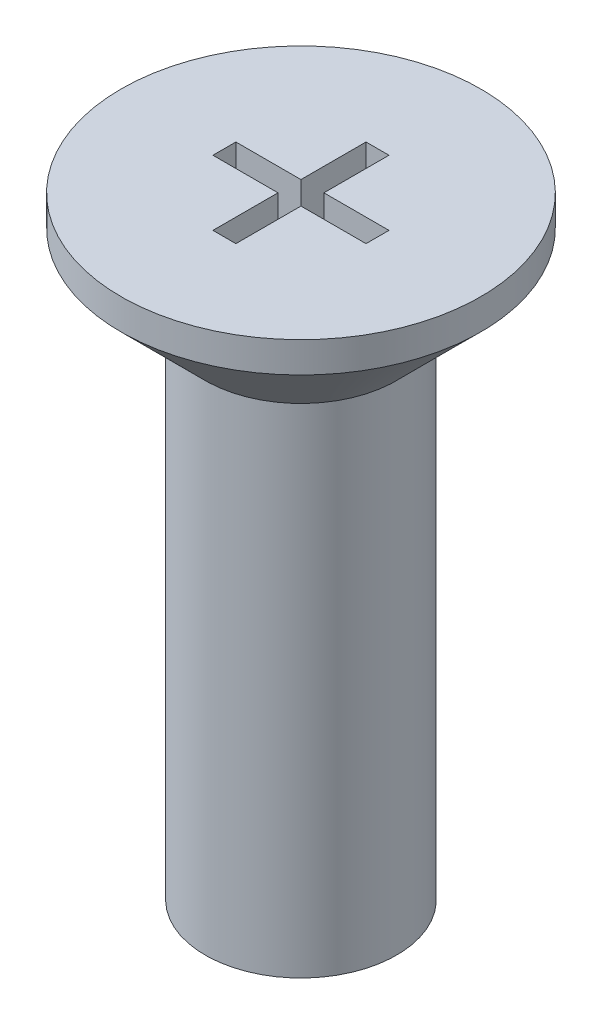
ISO-10303-21;
HEADER;
FILE_DESCRIPTION(('STEP AP214'),'2;1');
FILE_NAME('part.step','',(''),(''),'','','');
FILE_SCHEMA(('AUTOMOTIVE_DESIGN { 1 0 10303 214 1 1 1 1 }'));
ENDSEC;
DATA;
#1=APPLICATION_CONTEXT('core data for automotive mechanical design processes');
#2=APPLICATION_PROTOCOL_DEFINITION('international standard','automotive_design',2000,#1);
#3=PRODUCT_CONTEXT('',#1,'mechanical');
#4=PRODUCT('Part','Part','',(#3));
#5=PRODUCT_RELATED_PRODUCT_CATEGORY('part','',(#4));
#6=PRODUCT_DEFINITION_FORMATION('','',#4);
#7=PRODUCT_DEFINITION_CONTEXT('part definition',#1,'design');
#8=PRODUCT_DEFINITION('design','',#6,#7);
#9=PRODUCT_DEFINITION_SHAPE('','',#8);
#10=(LENGTH_UNIT() NAMED_UNIT(*) SI_UNIT(.MILLI.,.METRE.));
#11=(NAMED_UNIT(*) PLANE_ANGLE_UNIT() SI_UNIT($,.RADIAN.));
#12=(NAMED_UNIT(*) SI_UNIT($,.STERADIAN.) SOLID_ANGLE_UNIT());
#13=UNCERTAINTY_MEASURE_WITH_UNIT(LENGTH_MEASURE(1.E-05),#10,'distance_accuracy_value','');
#14=(GEOMETRIC_REPRESENTATION_CONTEXT(3) GLOBAL_UNCERTAINTY_ASSIGNED_CONTEXT((#13)) GLOBAL_UNIT_ASSIGNED_CONTEXT((#10,
#11,#12)) REPRESENTATION_CONTEXT('',''));
#15=CARTESIAN_POINT('',(0.,0.,0.));
#16=DIRECTION('',(0.,0.,1.));
#17=DIRECTION('',(1.,0.,0.));
#18=AXIS2_PLACEMENT_3D('',#15,#16,#17);
#19=CARTESIAN_POINT('',(0.,0.,0.));
#20=DIRECTION('',(0.,1.,0.));
#21=DIRECTION('',(-1.,0.,0.));
#22=AXIS2_PLACEMENT_3D('',#19,#20,#21);
#23=PLANE('',#22);
#24=CARTESIAN_POINT('',(0.,0.,0.));
#25=DIRECTION('',(0.,1.,0.));
#26=DIRECTION('',(-1.,0.,0.));
#27=AXIS2_PLACEMENT_3D('',#24,#25,#26);
#28=CIRCLE('',#27,1.25);
#29=CARTESIAN_POINT('',(-1.25,0.,0.));
#30=VERTEX_POINT('',#29);
#31=EDGE_CURVE('E11',#30,#30,#28,.T.);
#32=ORIENTED_EDGE('',*,*,#31,.F.);
#33=EDGE_LOOP('',(#32));
#34=FACE_BOUND('',#33,.T.);
#35=ADVANCED_FACE('F32',(#34),#23,.F.);
#36=CARTESIAN_POINT('',(0.,8.,0.));
#37=DIRECTION('',(0.,1.,0.));
#38=DIRECTION('',(-1.,0.,0.));
#39=AXIS2_PLACEMENT_3D('',#36,#37,#38);
#40=CYLINDRICAL_SURFACE('',#39,1.25);
#41=CARTESIAN_POINT('',(0.,6.5,0.));
#42=DIRECTION('',(0.,1.,0.));
#43=DIRECTION('',(-1.,0.,0.));
#44=AXIS2_PLACEMENT_3D('',#41,#42,#43);
#45=CIRCLE('',#44,1.25);
#46=CARTESIAN_POINT('',(-1.25,6.5,0.));
#47=VERTEX_POINT('',#46);
#48=EDGE_CURVE('E39',#47,#47,#45,.T.);
#49=ORIENTED_EDGE('',*,*,#48,.F.);
#50=EDGE_LOOP('',(#49));
#51=FACE_BOUND('',#50,.T.);
#52=ORIENTED_EDGE('',*,*,#31,.T.);
#53=EDGE_LOOP('',(#52));
#54=FACE_BOUND('',#53,.T.);
#55=ADVANCED_FACE('F213',(#51,#54),#40,.T.);
#56=CARTESIAN_POINT('',(0.,6.5,0.));
#57=DIRECTION('',(0.,1.,0.));
#58=DIRECTION('',(-1.,0.,0.));
#59=AXIS2_PLACEMENT_3D('',#56,#57,#58);
#60=CONICAL_SURFACE('',#59,1.25,0.785398163397451);
#61=CARTESIAN_POINT('',(0.,7.6,0.));
#62=DIRECTION('',(0.,1.,0.));
#63=DIRECTION('',(-1.,0.,0.));
#64=AXIS2_PLACEMENT_3D('',#61,#62,#63);
#65=CIRCLE('',#64,2.35);
#66=CARTESIAN_POINT('',(-2.35,7.6,0.));
#67=VERTEX_POINT('',#66);
#68=EDGE_CURVE('E206',#67,#67,#65,.T.);
#69=ORIENTED_EDGE('',*,*,#68,.F.);
#70=EDGE_LOOP('',(#69));
#71=FACE_BOUND('',#70,.T.);
#72=ORIENTED_EDGE('',*,*,#48,.T.);
#73=EDGE_LOOP('',(#72));
#74=FACE_BOUND('',#73,.T.);
#75=ADVANCED_FACE('F211',(#71,#74),#60,.T.);
#76=CARTESIAN_POINT('',(0.,8.,0.));
#77=DIRECTION('',(0.,1.,0.));
#78=DIRECTION('',(-1.,0.,0.));
#79=AXIS2_PLACEMENT_3D('',#76,#77,#78);
#80=CYLINDRICAL_SURFACE('',#79,2.35);
#81=CARTESIAN_POINT('',(0.,8.,0.));
#82=DIRECTION('',(0.,1.,0.));
#83=DIRECTION('',(-1.,0.,0.));
#84=AXIS2_PLACEMENT_3D('',#81,#82,#83);
#85=CIRCLE('',#84,2.35);
#86=CARTESIAN_POINT('',(-2.35,8.,0.));
#87=VERTEX_POINT('',#86);
#88=EDGE_CURVE('E186',#87,#87,#85,.T.);
#89=ORIENTED_EDGE('',*,*,#88,.F.);
#90=EDGE_LOOP('',(#89));
#91=FACE_BOUND('',#90,.T.);
#92=ORIENTED_EDGE('',*,*,#68,.T.);
#93=EDGE_LOOP('',(#92));
#94=FACE_BOUND('',#93,.T.);
#95=ADVANCED_FACE('F231',(#91,#94),#80,.T.);
#96=CARTESIAN_POINT('',(2.35,8.,0.));
#97=DIRECTION('',(0.,-1.,0.));
#98=DIRECTION('',(1.,0.,0.));
#99=AXIS2_PLACEMENT_3D('',#96,#97,#98);
#100=PLANE('',#99);
#101=DIRECTION('',(0.,0.,1.));
#102=VECTOR('',#101,1.);
#103=CARTESIAN_POINT('',(-0.15,8.,-0.15));
#104=LINE('',#103,#102);
#105=CARTESIAN_POINT('',(-0.15,8.,-1.));
#106=VERTEX_POINT('',#105);
#107=CARTESIAN_POINT('',(-0.15,8.,-0.15));
#108=VERTEX_POINT('',#107);
#109=EDGE_CURVE('E155',#106,#108,#104,.T.);
#110=ORIENTED_EDGE('',*,*,#109,.F.);
#111=DIRECTION('',(-1.,0.,0.));
#112=VECTOR('',#111,1.);
#113=CARTESIAN_POINT('',(0.,8.,-1.));
#114=LINE('',#113,#112);
#115=CARTESIAN_POINT('',(0.15,8.,-1.));
#116=VERTEX_POINT('',#115);
#117=EDGE_CURVE('E183',#116,#106,#114,.T.);
#118=ORIENTED_EDGE('',*,*,#117,.F.);
#119=DIRECTION('',(0.,0.,-1.));
#120=VECTOR('',#119,1.);
#121=CARTESIAN_POINT('',(0.15,8.,-1.));
#122=LINE('',#121,#120);
#123=CARTESIAN_POINT('',(0.15,8.,-0.15));
#124=VERTEX_POINT('',#123);
#125=EDGE_CURVE('E181',#124,#116,#122,.T.);
#126=ORIENTED_EDGE('',*,*,#125,.F.);
#127=DIRECTION('',(-1.,0.,0.));
#128=VECTOR('',#127,1.);
#129=CARTESIAN_POINT('',(0.15,8.,-0.15));
#130=LINE('',#129,#128);
#131=CARTESIAN_POINT('',(1.,8.,-0.15));
#132=VERTEX_POINT('',#131);
#133=EDGE_CURVE('E179',#132,#124,#130,.T.);
#134=ORIENTED_EDGE('',*,*,#133,.F.);
#135=DIRECTION('',(0.,0.,-1.));
#136=VECTOR('',#135,1.);
#137=CARTESIAN_POINT('',(1.,8.,-0.15));
#138=LINE('',#137,#136);
#139=CARTESIAN_POINT('',(1.,8.,0.15));
#140=VERTEX_POINT('',#139);
#141=EDGE_CURVE('E130',#140,#132,#138,.T.);
#142=ORIENTED_EDGE('',*,*,#141,.F.);
#143=DIRECTION('',(1.,0.,0.));
#144=VECTOR('',#143,1.);
#145=CARTESIAN_POINT('',(1.,8.,0.15));
#146=LINE('',#145,#144);
#147=CARTESIAN_POINT('',(0.15,8.,0.15));
#148=VERTEX_POINT('',#147);
#149=EDGE_CURVE('E175',#148,#140,#146,.T.);
#150=ORIENTED_EDGE('',*,*,#149,.F.);
#151=DIRECTION('',(0.,0.,-1.));
#152=VECTOR('',#151,1.);
#153=CARTESIAN_POINT('',(0.15,8.,0.15));
#154=LINE('',#153,#152);
#155=CARTESIAN_POINT('',(0.15,8.,1.));
#156=VERTEX_POINT('',#155);
#157=EDGE_CURVE('E172',#156,#148,#154,.T.);
#158=ORIENTED_EDGE('',*,*,#157,.F.);
#159=DIRECTION('',(1.,0.,0.));
#160=VECTOR('',#159,1.);
#161=CARTESIAN_POINT('',(0.15,8.,1.));
#162=LINE('',#161,#160);
#163=CARTESIAN_POINT('',(-0.15,8.,1.));
#164=VERTEX_POINT('',#163);
#165=EDGE_CURVE('E169',#164,#156,#162,.T.);
#166=ORIENTED_EDGE('',*,*,#165,.F.);
#167=DIRECTION('',(0.,0.,1.));
#168=VECTOR('',#167,1.);
#169=CARTESIAN_POINT('',(-0.15,8.,1.));
#170=LINE('',#169,#168);
#171=CARTESIAN_POINT('',(-0.15,8.,0.15));
#172=VERTEX_POINT('',#171);
#173=EDGE_CURVE('E166',#172,#164,#170,.T.);
#174=ORIENTED_EDGE('',*,*,#173,.F.);
#175=DIRECTION('',(1.,0.,0.));
#176=VECTOR('',#175,1.);
#177=CARTESIAN_POINT('',(-0.15,8.,0.15));
#178=LINE('',#177,#176);
#179=CARTESIAN_POINT('',(-1.,8.,0.15));
#180=VERTEX_POINT('',#179);
#181=EDGE_CURVE('E163',#180,#172,#178,.T.);
#182=ORIENTED_EDGE('',*,*,#181,.F.);
#183=DIRECTION('',(0.,0.,1.));
#184=VECTOR('',#183,1.);
#185=CARTESIAN_POINT('',(-1.,8.,0.15));
#186=LINE('',#185,#184);
#187=CARTESIAN_POINT('',(-1.,8.,-0.15));
#188=VERTEX_POINT('',#187);
#189=EDGE_CURVE('E160',#188,#180,#186,.T.);
#190=ORIENTED_EDGE('',*,*,#189,.F.);
#191=DIRECTION('',(-1.,0.,0.));
#192=VECTOR('',#191,1.);
#193=CARTESIAN_POINT('',(-1.,8.,-0.15));
#194=LINE('',#193,#192);
#195=EDGE_CURVE('E157',#108,#188,#194,.T.);
#196=ORIENTED_EDGE('',*,*,#195,.F.);
#197=EDGE_LOOP('',(#110,#118,#126,#134,#142,#150,#158,#166,#174,#182,#190,#196));
#198=FACE_BOUND('',#197,.T.);
#199=ORIENTED_EDGE('',*,*,#88,.T.);
#200=EDGE_LOOP('',(#199));
#201=FACE_BOUND('',#200,.T.);
#202=ADVANCED_FACE('F239',(#198,#201),#100,.F.);
#203=CARTESIAN_POINT('',(0.,7.,-1.));
#204=DIRECTION('',(0.,0.,-1.));
#205=DIRECTION('',(-1.,0.,0.));
#206=AXIS2_PLACEMENT_3D('',#203,#204,#205);
#207=PLANE('',#206);
#208=ORIENTED_EDGE('',*,*,#117,.T.);
#209=DIRECTION('',(0.,1.,0.));
#210=VECTOR('',#209,1.);
#211=CARTESIAN_POINT('',(-0.15,7.,-1.));
#212=LINE('',#211,#210);
#213=CARTESIAN_POINT('',(-0.15,7.,-1.));
#214=VERTEX_POINT('',#213);
#215=EDGE_CURVE('E46',#214,#106,#212,.T.);
#216=ORIENTED_EDGE('',*,*,#215,.F.);
#217=DIRECTION('',(-1.,0.,0.));
#218=VECTOR('',#217,1.);
#219=CARTESIAN_POINT('',(-0.15,7.,-1.));
#220=LINE('',#219,#218);
#221=CARTESIAN_POINT('',(0.15,7.,-1.));
#222=VERTEX_POINT('',#221);
#223=EDGE_CURVE('E54',#222,#214,#220,.T.);
#224=ORIENTED_EDGE('',*,*,#223,.F.);
#225=DIRECTION('',(0.,1.,0.));
#226=VECTOR('',#225,1.);
#227=CARTESIAN_POINT('',(0.15,7.,-1.));
#228=LINE('',#227,#226);
#229=EDGE_CURVE('E92',#222,#116,#228,.T.);
#230=ORIENTED_EDGE('',*,*,#229,.T.);
#231=EDGE_LOOP('',(#208,#216,#224,#230));
#232=FACE_BOUND('',#231,.T.);
#233=ADVANCED_FACE('F247',(#232),#207,.F.);
#234=CARTESIAN_POINT('',(0.15,7.,-1.));
#235=DIRECTION('',(1.,0.,0.));
#236=DIRECTION('',(0.,0.,-1.));
#237=AXIS2_PLACEMENT_3D('',#234,#235,#236);
#238=PLANE('',#237);
#239=ORIENTED_EDGE('',*,*,#125,.T.);
#240=ORIENTED_EDGE('',*,*,#229,.F.);
#241=DIRECTION('',(0.,0.,-1.));
#242=VECTOR('',#241,1.);
#243=CARTESIAN_POINT('',(0.15,7.,-1.));
#244=LINE('',#243,#242);
#245=CARTESIAN_POINT('',(0.15,7.,-0.15));
#246=VERTEX_POINT('',#245);
#247=EDGE_CURVE('E143',#246,#222,#244,.T.);
#248=ORIENTED_EDGE('',*,*,#247,.F.);
#249=DIRECTION('',(0.,1.,0.));
#250=VECTOR('',#249,1.);
#251=CARTESIAN_POINT('',(0.15,7.,-0.15));
#252=LINE('',#251,#250);
#253=EDGE_CURVE('E134',#246,#124,#252,.T.);
#254=ORIENTED_EDGE('',*,*,#253,.T.);
#255=EDGE_LOOP('',(#239,#240,#248,#254));
#256=FACE_BOUND('',#255,.T.);
#257=ADVANCED_FACE('F255',(#256),#238,.F.);
#258=CARTESIAN_POINT('',(0.15,7.,-0.15));
#259=DIRECTION('',(0.,0.,-1.));
#260=DIRECTION('',(-1.,0.,0.));
#261=AXIS2_PLACEMENT_3D('',#258,#259,#260);
#262=PLANE('',#261);
#263=ORIENTED_EDGE('',*,*,#133,.T.);
#264=ORIENTED_EDGE('',*,*,#253,.F.);
#265=DIRECTION('',(-1.,0.,0.));
#266=VECTOR('',#265,1.);
#267=CARTESIAN_POINT('',(0.15,7.,-0.15));
#268=LINE('',#267,#266);
#269=CARTESIAN_POINT('',(1.,7.,-0.15));
#270=VERTEX_POINT('',#269);
#271=EDGE_CURVE('E138',#270,#246,#268,.T.);
#272=ORIENTED_EDGE('',*,*,#271,.F.);
#273=DIRECTION('',(0.,1.,0.));
#274=VECTOR('',#273,1.);
#275=CARTESIAN_POINT('',(1.,7.,-0.15));
#276=LINE('',#275,#274);
#277=EDGE_CURVE('E123',#270,#132,#276,.T.);
#278=ORIENTED_EDGE('',*,*,#277,.T.);
#279=EDGE_LOOP('',(#263,#264,#272,#278));
#280=FACE_BOUND('',#279,.T.);
#281=ADVANCED_FACE('F139',(#280),#262,.F.);
#282=CARTESIAN_POINT('',(1.,7.,-0.15));
#283=DIRECTION('',(1.,0.,0.));
#284=DIRECTION('',(0.,1.,0.));
#285=AXIS2_PLACEMENT_3D('',#282,#283,#284);
#286=PLANE('',#285);
#287=ORIENTED_EDGE('',*,*,#141,.T.);
#288=ORIENTED_EDGE('',*,*,#277,.F.);
#289=DIRECTION('',(0.,0.,-1.));
#290=VECTOR('',#289,1.);
#291=CARTESIAN_POINT('',(1.,7.,-0.15));
#292=LINE('',#291,#290);
#293=CARTESIAN_POINT('',(1.,7.,0.15));
#294=VERTEX_POINT('',#293);
#295=EDGE_CURVE('E127',#294,#270,#292,.T.);
#296=ORIENTED_EDGE('',*,*,#295,.F.);
#297=DIRECTION('',(0.,1.,0.));
#298=VECTOR('',#297,1.);
#299=CARTESIAN_POINT('',(1.,7.,0.15));
#300=LINE('',#299,#298);
#301=EDGE_CURVE('E135',#294,#140,#300,.T.);
#302=ORIENTED_EDGE('',*,*,#301,.T.);
#303=EDGE_LOOP('',(#287,#288,#296,#302));
#304=FACE_BOUND('',#303,.T.);
#305=ADVANCED_FACE('F125',(#304),#286,.F.);
#306=CARTESIAN_POINT('',(1.,7.,0.15));
#307=DIRECTION('',(0.,0.,1.));
#308=DIRECTION('',(1.,0.,0.));
#309=AXIS2_PLACEMENT_3D('',#306,#307,#308);
#310=PLANE('',#309);
#311=ORIENTED_EDGE('',*,*,#149,.T.);
#312=ORIENTED_EDGE('',*,*,#301,.F.);
#313=DIRECTION('',(1.,0.,0.));
#314=VECTOR('',#313,1.);
#315=CARTESIAN_POINT('',(1.,7.,0.15));
#316=LINE('',#315,#314);
#317=CARTESIAN_POINT('',(0.15,7.,0.15));
#318=VERTEX_POINT('',#317);
#319=EDGE_CURVE('E148',#318,#294,#316,.T.);
#320=ORIENTED_EDGE('',*,*,#319,.F.);
#321=DIRECTION('',(0.,1.,0.));
#322=VECTOR('',#321,1.);
#323=CARTESIAN_POINT('',(0.15,7.,0.15));
#324=LINE('',#323,#322);
#325=EDGE_CURVE('E189',#318,#148,#324,.T.);
#326=ORIENTED_EDGE('',*,*,#325,.T.);
#327=EDGE_LOOP('',(#311,#312,#320,#326));
#328=FACE_BOUND('',#327,.T.);
#329=ADVANCED_FACE('F275',(#328),#310,.F.);
#330=CARTESIAN_POINT('',(0.15,7.,0.15));
#331=DIRECTION('',(1.,0.,0.));
#332=DIRECTION('',(0.,0.,-1.));
#333=AXIS2_PLACEMENT_3D('',#330,#331,#332);
#334=PLANE('',#333);
#335=ORIENTED_EDGE('',*,*,#157,.T.);
#336=ORIENTED_EDGE('',*,*,#325,.F.);
#337=DIRECTION('',(0.,0.,-1.));
#338=VECTOR('',#337,1.);
#339=CARTESIAN_POINT('',(0.15,7.,0.15));
#340=LINE('',#339,#338);
#341=CARTESIAN_POINT('',(0.15,7.,1.));
#342=VERTEX_POINT('',#341);
#343=EDGE_CURVE('E150',#342,#318,#340,.T.);
#344=ORIENTED_EDGE('',*,*,#343,.F.);
#345=DIRECTION('',(0.,1.,0.));
#346=VECTOR('',#345,1.);
#347=CARTESIAN_POINT('',(0.15,7.,1.));
#348=LINE('',#347,#346);
#349=EDGE_CURVE('E191',#342,#156,#348,.T.);
#350=ORIENTED_EDGE('',*,*,#349,.T.);
#351=EDGE_LOOP('',(#335,#336,#344,#350));
#352=FACE_BOUND('',#351,.T.);
#353=ADVANCED_FACE('F282',(#352),#334,.F.);
#354=CARTESIAN_POINT('',(0.15,7.,1.));
#355=DIRECTION('',(0.,0.,1.));
#356=DIRECTION('',(1.,0.,0.));
#357=AXIS2_PLACEMENT_3D('',#354,#355,#356);
#358=PLANE('',#357);
#359=ORIENTED_EDGE('',*,*,#165,.T.);
#360=ORIENTED_EDGE('',*,*,#349,.F.);
#361=DIRECTION('',(1.,0.,0.));
#362=VECTOR('',#361,1.);
#363=CARTESIAN_POINT('',(0.15,7.,1.));
#364=LINE('',#363,#362);
#365=CARTESIAN_POINT('',(-0.15,7.,1.));
#366=VERTEX_POINT('',#365);
#367=EDGE_CURVE('E410',#366,#342,#364,.T.);
#368=ORIENTED_EDGE('',*,*,#367,.F.);
#369=DIRECTION('',(0.,1.,0.));
#370=VECTOR('',#369,1.);
#371=CARTESIAN_POINT('',(-0.15,7.,1.));
#372=LINE('',#371,#370);
#373=EDGE_CURVE('E193',#366,#164,#372,.T.);
#374=ORIENTED_EDGE('',*,*,#373,.T.);
#375=EDGE_LOOP('',(#359,#360,#368,#374));
#376=FACE_BOUND('',#375,.T.);
#377=ADVANCED_FACE('F290',(#376),#358,.F.);
#378=CARTESIAN_POINT('',(-0.15,7.,1.));
#379=DIRECTION('',(-1.,0.,0.));
#380=DIRECTION('',(0.,-1.,0.));
#381=AXIS2_PLACEMENT_3D('',#378,#379,#380);
#382=PLANE('',#381);
#383=ORIENTED_EDGE('',*,*,#173,.T.);
#384=ORIENTED_EDGE('',*,*,#373,.F.);
#385=DIRECTION('',(0.,0.,1.));
#386=VECTOR('',#385,1.);
#387=CARTESIAN_POINT('',(-0.15,7.,1.));
#388=LINE('',#387,#386);
#389=CARTESIAN_POINT('',(-0.15,7.,0.15));
#390=VERTEX_POINT('',#389);
#391=EDGE_CURVE('E407',#390,#366,#388,.T.);
#392=ORIENTED_EDGE('',*,*,#391,.F.);
#393=DIRECTION('',(0.,1.,0.));
#394=VECTOR('',#393,1.);
#395=CARTESIAN_POINT('',(-0.15,7.,0.15));
#396=LINE('',#395,#394);
#397=EDGE_CURVE('E195',#390,#172,#396,.T.);
#398=ORIENTED_EDGE('',*,*,#397,.T.);
#399=EDGE_LOOP('',(#383,#384,#392,#398));
#400=FACE_BOUND('',#399,.T.);
#401=ADVANCED_FACE('F298',(#400),#382,.F.);
#402=CARTESIAN_POINT('',(-0.15,7.,0.15));
#403=DIRECTION('',(0.,0.,1.));
#404=DIRECTION('',(1.,0.,0.));
#405=AXIS2_PLACEMENT_3D('',#402,#403,#404);
#406=PLANE('',#405);
#407=ORIENTED_EDGE('',*,*,#181,.T.);
#408=ORIENTED_EDGE('',*,*,#397,.F.);
#409=DIRECTION('',(1.,0.,0.));
#410=VECTOR('',#409,1.);
#411=CARTESIAN_POINT('',(-0.15,7.,0.15));
#412=LINE('',#411,#410);
#413=CARTESIAN_POINT('',(-1.,7.,0.15));
#414=VERTEX_POINT('',#413);
#415=EDGE_CURVE('E404',#414,#390,#412,.T.);
#416=ORIENTED_EDGE('',*,*,#415,.F.);
#417=DIRECTION('',(0.,1.,0.));
#418=VECTOR('',#417,1.);
#419=CARTESIAN_POINT('',(-1.,7.,0.15));
#420=LINE('',#419,#418);
#421=EDGE_CURVE('E197',#414,#180,#420,.T.);
#422=ORIENTED_EDGE('',*,*,#421,.T.);
#423=EDGE_LOOP('',(#407,#408,#416,#422));
#424=FACE_BOUND('',#423,.T.);
#425=ADVANCED_FACE('F306',(#424),#406,.F.);
#426=CARTESIAN_POINT('',(-1.,7.,0.15));
#427=DIRECTION('',(-1.,0.,0.));
#428=DIRECTION('',(0.,-1.,0.));
#429=AXIS2_PLACEMENT_3D('',#426,#427,#428);
#430=PLANE('',#429);
#431=ORIENTED_EDGE('',*,*,#189,.T.);
#432=ORIENTED_EDGE('',*,*,#421,.F.);
#433=DIRECTION('',(0.,0.,1.));
#434=VECTOR('',#433,1.);
#435=CARTESIAN_POINT('',(-1.,7.,0.15));
#436=LINE('',#435,#434);
#437=CARTESIAN_POINT('',(-1.,7.,-0.15));
#438=VERTEX_POINT('',#437);
#439=EDGE_CURVE('E397',#438,#414,#436,.T.);
#440=ORIENTED_EDGE('',*,*,#439,.F.);
#441=DIRECTION('',(0.,1.,0.));
#442=VECTOR('',#441,1.);
#443=CARTESIAN_POINT('',(-1.,7.,-0.15));
#444=LINE('',#443,#442);
#445=EDGE_CURVE('E199',#438,#188,#444,.T.);
#446=ORIENTED_EDGE('',*,*,#445,.T.);
#447=EDGE_LOOP('',(#431,#432,#440,#446));
#448=FACE_BOUND('',#447,.T.);
#449=ADVANCED_FACE('F314',(#448),#430,.F.);
#450=CARTESIAN_POINT('',(-1.,7.,-0.15));
#451=DIRECTION('',(0.,0.,-1.));
#452=DIRECTION('',(-1.,0.,0.));
#453=AXIS2_PLACEMENT_3D('',#450,#451,#452);
#454=PLANE('',#453);
#455=ORIENTED_EDGE('',*,*,#195,.T.);
#456=ORIENTED_EDGE('',*,*,#445,.F.);
#457=DIRECTION('',(-1.,0.,0.));
#458=VECTOR('',#457,1.);
#459=CARTESIAN_POINT('',(-1.,7.,-0.15));
#460=LINE('',#459,#458);
#461=CARTESIAN_POINT('',(-0.15,7.,-0.15));
#462=VERTEX_POINT('',#461);
#463=EDGE_CURVE('E394',#462,#438,#460,.T.);
#464=ORIENTED_EDGE('',*,*,#463,.F.);
#465=DIRECTION('',(0.,1.,0.));
#466=VECTOR('',#465,1.);
#467=CARTESIAN_POINT('',(-0.15,7.,-0.15));
#468=LINE('',#467,#466);
#469=EDGE_CURVE('E201',#462,#108,#468,.T.);
#470=ORIENTED_EDGE('',*,*,#469,.T.);
#471=EDGE_LOOP('',(#455,#456,#464,#470));
#472=FACE_BOUND('',#471,.T.);
#473=ADVANCED_FACE('F322',(#472),#454,.F.);
#474=CARTESIAN_POINT('',(-0.15,7.,-0.15));
#475=DIRECTION('',(-1.,0.,0.));
#476=DIRECTION('',(0.,0.,1.));
#477=AXIS2_PLACEMENT_3D('',#474,#475,#476);
#478=PLANE('',#477);
#479=ORIENTED_EDGE('',*,*,#109,.T.);
#480=ORIENTED_EDGE('',*,*,#469,.F.);
#481=DIRECTION('',(0.,0.,1.));
#482=VECTOR('',#481,1.);
#483=CARTESIAN_POINT('',(-0.15,7.,-0.15));
#484=LINE('',#483,#482);
#485=EDGE_CURVE('E398',#214,#462,#484,.T.);
#486=ORIENTED_EDGE('',*,*,#485,.F.);
#487=ORIENTED_EDGE('',*,*,#215,.T.);
#488=EDGE_LOOP('',(#479,#480,#486,#487));
#489=FACE_BOUND('',#488,.T.);
#490=ADVANCED_FACE('F330',(#489),#478,.F.);
#491=CARTESIAN_POINT('',(0.,7.,0.));
#492=DIRECTION('',(0.,-1.,0.));
#493=DIRECTION('',(0.,0.,-1.));
#494=AXIS2_PLACEMENT_3D('',#491,#492,#493);
#495=PLANE('',#494);
#496=ORIENTED_EDGE('',*,*,#223,.T.);
#497=ORIENTED_EDGE('',*,*,#485,.T.);
#498=ORIENTED_EDGE('',*,*,#463,.T.);
#499=ORIENTED_EDGE('',*,*,#439,.T.);
#500=ORIENTED_EDGE('',*,*,#415,.T.);
#501=ORIENTED_EDGE('',*,*,#391,.T.);
#502=ORIENTED_EDGE('',*,*,#367,.T.);
#503=ORIENTED_EDGE('',*,*,#343,.T.);
#504=ORIENTED_EDGE('',*,*,#319,.T.);
#505=ORIENTED_EDGE('',*,*,#295,.T.);
#506=ORIENTED_EDGE('',*,*,#271,.T.);
#507=ORIENTED_EDGE('',*,*,#247,.T.);
#508=EDGE_LOOP('',(#496,#497,#498,#499,#500,#501,#502,#503,#504,#505,#506,#507));
#509=FACE_BOUND('',#508,.T.);
#510=ADVANCED_FACE('F145',(#509),#495,.F.);
#511=CLOSED_SHELL('',(#35,#55,#75,#95,#202,#233,#257,#281,#305,#329,#353,#377,#401,#425,#449,
#473,#490,#510));
#512=MANIFOLD_SOLID_BREP('B2',#511);
#513=ADVANCED_BREP_SHAPE_REPRESENTATION('',(#18,#512),#14);
#514=SHAPE_DEFINITION_REPRESENTATION(#9,#513);
ENDSEC;
END-ISO-10303-21;
